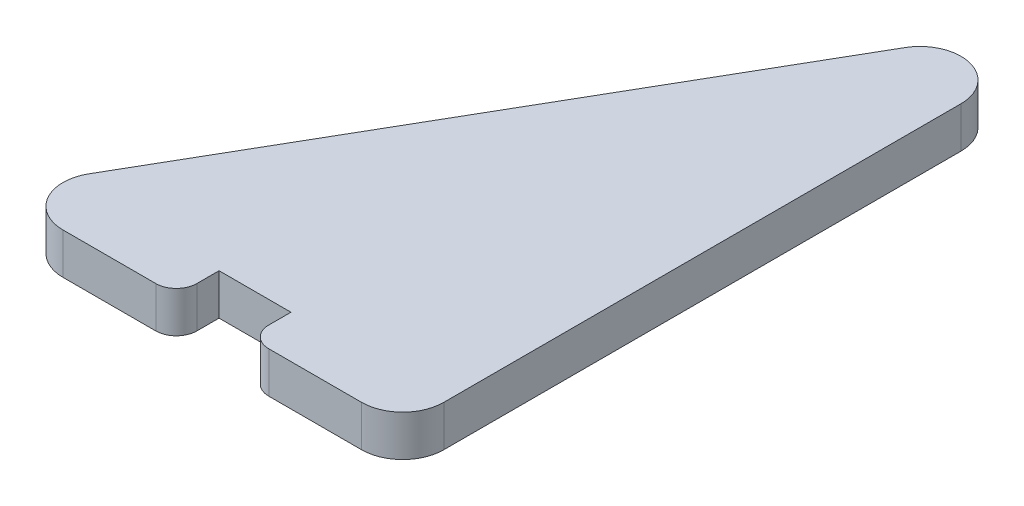
ISO-10303-21;
HEADER;
FILE_DESCRIPTION(('STEP AP214'),'2;1');
FILE_NAME('part.step','',(''),(''),'','','');
FILE_SCHEMA(('AUTOMOTIVE_DESIGN { 1 0 10303 214 1 1 1 1 }'));
ENDSEC;
DATA;
#1=APPLICATION_CONTEXT('core data for automotive mechanical design processes');
#2=APPLICATION_PROTOCOL_DEFINITION('international standard','automotive_design',2000,#1);
#3=PRODUCT_CONTEXT('',#1,'mechanical');
#4=PRODUCT('Part','Part','',(#3));
#5=PRODUCT_RELATED_PRODUCT_CATEGORY('part','',(#4));
#6=PRODUCT_DEFINITION_FORMATION('','',#4);
#7=PRODUCT_DEFINITION_CONTEXT('part definition',#1,'design');
#8=PRODUCT_DEFINITION('design','',#6,#7);
#9=PRODUCT_DEFINITION_SHAPE('','',#8);
#10=(LENGTH_UNIT() NAMED_UNIT(*) SI_UNIT(.MILLI.,.METRE.));
#11=(NAMED_UNIT(*) PLANE_ANGLE_UNIT() SI_UNIT($,.RADIAN.));
#12=(NAMED_UNIT(*) SI_UNIT($,.STERADIAN.) SOLID_ANGLE_UNIT());
#13=UNCERTAINTY_MEASURE_WITH_UNIT(LENGTH_MEASURE(1.E-05),#10,'distance_accuracy_value','');
#14=(GEOMETRIC_REPRESENTATION_CONTEXT(3) GLOBAL_UNCERTAINTY_ASSIGNED_CONTEXT((#13)) GLOBAL_UNIT_ASSIGNED_CONTEXT((#10,
#11,#12)) REPRESENTATION_CONTEXT('',''));
#15=CARTESIAN_POINT('',(0.,0.,0.));
#16=DIRECTION('',(0.,0.,1.));
#17=DIRECTION('',(1.,0.,0.));
#18=AXIS2_PLACEMENT_3D('',#15,#16,#17);
#19=CARTESIAN_POINT('',(-52.5014773719376,6.35,0.));
#20=DIRECTION('',(0.,0.,-1.));
#21=DIRECTION('',(-1.,0.,0.));
#22=AXIS2_PLACEMENT_3D('',#19,#20,#21);
#23=PLANE('',#22);
#24=DIRECTION('',(0.,-1.,0.));
#25=VECTOR('',#24,1.);
#26=CARTESIAN_POINT('',(-20.6944886859688,6.35,0.));
#27=LINE('',#26,#25);
#28=CARTESIAN_POINT('',(-20.6944886859688,6.35,0.));
#29=VERTEX_POINT('',#28);
#30=CARTESIAN_POINT('',(-20.6944886859688,0.,0.));
#31=VERTEX_POINT('',#30);
#32=EDGE_CURVE('E213',#29,#31,#27,.T.);
#33=ORIENTED_EDGE('',*,*,#32,.T.);
#34=DIRECTION('',(1.,0.,0.));
#35=VECTOR('',#34,1.);
#36=CARTESIAN_POINT('',(-52.5014773719376,0.,0.));
#37=LINE('',#36,#35);
#38=CARTESIAN_POINT('',(-6.35000000000004,0.,0.));
#39=VERTEX_POINT('',#38);
#40=EDGE_CURVE('E134',#31,#39,#37,.T.);
#41=ORIENTED_EDGE('',*,*,#40,.T.);
#42=DIRECTION('',(0.,-1.,0.));
#43=VECTOR('',#42,1.);
#44=CARTESIAN_POINT('',(-6.35000000000004,6.35,0.));
#45=LINE('',#44,#43);
#46=CARTESIAN_POINT('',(-6.35000000000004,6.35,0.));
#47=VERTEX_POINT('',#46);
#48=EDGE_CURVE('E40',#47,#39,#45,.T.);
#49=ORIENTED_EDGE('',*,*,#48,.F.);
#50=DIRECTION('',(1.,0.,0.));
#51=VECTOR('',#50,1.);
#52=CARTESIAN_POINT('',(-52.5014773719376,6.35,0.));
#53=LINE('',#52,#51);
#54=EDGE_CURVE('E166',#29,#47,#53,.T.);
#55=ORIENTED_EDGE('',*,*,#54,.F.);
#56=EDGE_LOOP('',(#33,#41,#49,#55));
#57=FACE_BOUND('',#56,.T.);
#58=ADVANCED_FACE('F32',(#57),#23,.F.);
#59=CARTESIAN_POINT('',(-52.5014773719376,6.35,-6.34999999999999));
#60=DIRECTION('',(0.,1.,0.));
#61=DIRECTION('',(0.,0.,1.));
#62=AXIS2_PLACEMENT_3D('',#59,#60,#61);
#63=PLANE('',#62);
#64=CARTESIAN_POINT('',(-38.1569886859688,6.35,-3.175));
#65=DIRECTION('',(0.,1.,0.));
#66=DIRECTION('',(0.,0.,-1.));
#67=AXIS2_PLACEMENT_3D('',#64,#65,#66);
#68=CIRCLE('',#67,3.175);
#69=CARTESIAN_POINT('',(-38.1569886859688,6.35,0.));
#70=VERTEX_POINT('',#69);
#71=CARTESIAN_POINT('',(-34.9819886859688,6.35,-3.175));
#72=VERTEX_POINT('',#71);
#73=EDGE_CURVE('E176',#70,#72,#68,.T.);
#74=ORIENTED_EDGE('',*,*,#73,.T.);
#75=DIRECTION('',(0.,0.,-1.));
#76=VECTOR('',#75,1.);
#77=CARTESIAN_POINT('',(-34.9819886859688,6.35,-6.604));
#78=LINE('',#77,#76);
#79=CARTESIAN_POINT('',(-34.9819886859688,6.35,-6.604));
#80=VERTEX_POINT('',#79);
#81=EDGE_CURVE('E226',#72,#80,#78,.T.);
#82=ORIENTED_EDGE('',*,*,#81,.T.);
#83=DIRECTION('',(1.,0.,0.));
#84=VECTOR('',#83,1.);
#85=CARTESIAN_POINT('',(-23.8694886859688,6.35,-6.604));
#86=LINE('',#85,#84);
#87=CARTESIAN_POINT('',(-23.8694886859688,6.35,-6.604));
#88=VERTEX_POINT('',#87);
#89=EDGE_CURVE('E214',#80,#88,#86,.T.);
#90=ORIENTED_EDGE('',*,*,#89,.T.);
#91=DIRECTION('',(0.,0.,1.));
#92=VECTOR('',#91,1.);
#93=CARTESIAN_POINT('',(-23.8694886859688,6.35,-3.175));
#94=LINE('',#93,#92);
#95=CARTESIAN_POINT('',(-23.8694886859688,6.35,-3.175));
#96=VERTEX_POINT('',#95);
#97=EDGE_CURVE('E210',#88,#96,#94,.T.);
#98=ORIENTED_EDGE('',*,*,#97,.T.);
#99=CARTESIAN_POINT('',(-20.6944886859688,6.35,-3.175));
#100=DIRECTION('',(0.,1.,0.));
#101=DIRECTION('',(0.,0.,-1.));
#102=AXIS2_PLACEMENT_3D('',#99,#100,#101);
#103=CIRCLE('',#102,3.175);
#104=EDGE_CURVE('E216',#96,#29,#103,.T.);
#105=ORIENTED_EDGE('',*,*,#104,.T.);
#106=ORIENTED_EDGE('',*,*,#54,.T.);
#107=CARTESIAN_POINT('',(-6.35,6.35,-6.35));
#108=DIRECTION('',(0.,1.,0.));
#109=DIRECTION('',(0.,0.,-1.));
#110=AXIS2_PLACEMENT_3D('',#107,#108,#109);
#111=CIRCLE('',#110,6.35);
#112=CARTESIAN_POINT('',(0.,6.35,-6.35000000000004));
#113=VERTEX_POINT('',#112);
#114=EDGE_CURVE('E110',#47,#113,#111,.T.);
#115=ORIENTED_EDGE('',*,*,#114,.T.);
#116=DIRECTION('',(0.,0.,-1.));
#117=VECTOR('',#116,1.);
#118=CARTESIAN_POINT('',(0.,6.35,-6.35000000000004));
#119=LINE('',#118,#117);
#120=CARTESIAN_POINT('',(0.,6.35,-86.2867036525604));
#121=VERTEX_POINT('',#120);
#122=EDGE_CURVE('E102',#113,#121,#119,.T.);
#123=ORIENTED_EDGE('',*,*,#122,.T.);
#124=CARTESIAN_POINT('',(-6.35,6.35,-86.2867036525604));
#125=DIRECTION('',(0.,1.,0.));
#126=DIRECTION('',(0.,0.,1.));
#127=AXIS2_PLACEMENT_3D('',#124,#125,#126);
#128=CIRCLE('',#127,6.35);
#129=CARTESIAN_POINT('',(-11.8492613140312,6.35,-89.4617036525604));
#130=VERTEX_POINT('',#129);
#131=EDGE_CURVE('E107',#121,#130,#128,.T.);
#132=ORIENTED_EDGE('',*,*,#131,.T.);
#133=DIRECTION('',(-0.500000000000004,0.,0.866025403784436));
#134=VECTOR('',#133,1.);
#135=CARTESIAN_POINT('',(-11.8492613140312,6.35,-89.4617036525604));
#136=LINE('',#135,#134);
#137=CARTESIAN_POINT('',(-58.0007386859687,6.35,-9.52500000000002));
#138=VERTEX_POINT('',#137);
#139=EDGE_CURVE('E56',#130,#138,#136,.T.);
#140=ORIENTED_EDGE('',*,*,#139,.T.);
#141=CARTESIAN_POINT('',(-52.5014773719376,6.35,-6.34999999999999));
#142=DIRECTION('',(0.,1.,0.));
#143=DIRECTION('',(0.,0.,1.));
#144=AXIS2_PLACEMENT_3D('',#141,#142,#143);
#145=CIRCLE('',#144,6.35);
#146=CARTESIAN_POINT('',(-52.5014773719376,6.35,0.));
#147=VERTEX_POINT('',#146);
#148=EDGE_CURVE('E145',#138,#147,#145,.T.);
#149=ORIENTED_EDGE('',*,*,#148,.T.);
#150=EDGE_CURVE('E91',#147,#70,#53,.T.);
#151=ORIENTED_EDGE('',*,*,#150,.T.);
#152=EDGE_LOOP('',(#74,#82,#90,#98,#105,#106,#115,#123,#132,#140,#149,#151));
#153=FACE_BOUND('',#152,.T.);
#154=ADVANCED_FACE('F105',(#153),#63,.T.);
#155=CARTESIAN_POINT('',(-52.5014773719376,0.,-6.34999999999999));
#156=DIRECTION('',(0.,1.,0.));
#157=DIRECTION('',(0.,0.,1.));
#158=AXIS2_PLACEMENT_3D('',#155,#156,#157);
#159=PLANE('',#158);
#160=DIRECTION('',(0.,0.,-1.));
#161=VECTOR('',#160,1.);
#162=CARTESIAN_POINT('',(-34.9819886859688,0.,-6.604));
#163=LINE('',#162,#161);
#164=CARTESIAN_POINT('',(-34.9819886859688,0.,-3.175));
#165=VERTEX_POINT('',#164);
#166=CARTESIAN_POINT('',(-34.9819886859688,0.,-6.604));
#167=VERTEX_POINT('',#166);
#168=EDGE_CURVE('E222',#165,#167,#163,.T.);
#169=ORIENTED_EDGE('',*,*,#168,.F.);
#170=CARTESIAN_POINT('',(-38.1569886859688,0.,-3.175));
#171=DIRECTION('',(0.,1.,0.));
#172=DIRECTION('',(0.,0.,-1.));
#173=AXIS2_PLACEMENT_3D('',#170,#171,#172);
#174=CIRCLE('',#173,3.175);
#175=CARTESIAN_POINT('',(-38.1569886859688,0.,0.));
#176=VERTEX_POINT('',#175);
#177=EDGE_CURVE('E232',#176,#165,#174,.T.);
#178=ORIENTED_EDGE('',*,*,#177,.F.);
#179=CARTESIAN_POINT('',(-52.5014773719376,0.,0.));
#180=VERTEX_POINT('',#179);
#181=EDGE_CURVE('E136',#180,#176,#37,.T.);
#182=ORIENTED_EDGE('',*,*,#181,.F.);
#183=CARTESIAN_POINT('',(-52.5014773719376,0.,-6.34999999999999));
#184=DIRECTION('',(0.,1.,0.));
#185=DIRECTION('',(0.,0.,1.));
#186=AXIS2_PLACEMENT_3D('',#183,#184,#185);
#187=CIRCLE('',#186,6.35);
#188=CARTESIAN_POINT('',(-58.0007386859687,0.,-9.52500000000002));
#189=VERTEX_POINT('',#188);
#190=EDGE_CURVE('E131',#189,#180,#187,.T.);
#191=ORIENTED_EDGE('',*,*,#190,.F.);
#192=DIRECTION('',(-0.500000000000004,0.,0.866025403784436));
#193=VECTOR('',#192,1.);
#194=CARTESIAN_POINT('',(-11.8492613140312,0.,-89.4617036525604));
#195=LINE('',#194,#193);
#196=CARTESIAN_POINT('',(-11.8492613140312,0.,-89.4617036525604));
#197=VERTEX_POINT('',#196);
#198=EDGE_CURVE('E83',#197,#189,#195,.T.);
#199=ORIENTED_EDGE('',*,*,#198,.F.);
#200=CARTESIAN_POINT('',(-6.35,0.,-86.2867036525604));
#201=DIRECTION('',(0.,1.,0.));
#202=DIRECTION('',(0.,0.,1.));
#203=AXIS2_PLACEMENT_3D('',#200,#201,#202);
#204=CIRCLE('',#203,6.35);
#205=CARTESIAN_POINT('',(0.,0.,-86.2867036525604));
#206=VERTEX_POINT('',#205);
#207=EDGE_CURVE('E142',#206,#197,#204,.T.);
#208=ORIENTED_EDGE('',*,*,#207,.F.);
#209=DIRECTION('',(0.,0.,-1.));
#210=VECTOR('',#209,1.);
#211=CARTESIAN_POINT('',(0.,0.,-6.35000000000004));
#212=LINE('',#211,#210);
#213=CARTESIAN_POINT('',(0.,0.,-6.35000000000004));
#214=VERTEX_POINT('',#213);
#215=EDGE_CURVE('E119',#214,#206,#212,.T.);
#216=ORIENTED_EDGE('',*,*,#215,.F.);
#217=CARTESIAN_POINT('',(-6.35,0.,-6.35));
#218=DIRECTION('',(0.,1.,0.));
#219=DIRECTION('',(0.,0.,-1.));
#220=AXIS2_PLACEMENT_3D('',#217,#218,#219);
#221=CIRCLE('',#220,6.35);
#222=EDGE_CURVE('E139',#39,#214,#221,.T.);
#223=ORIENTED_EDGE('',*,*,#222,.F.);
#224=ORIENTED_EDGE('',*,*,#40,.F.);
#225=CARTESIAN_POINT('',(-20.6944886859688,0.,-3.175));
#226=DIRECTION('',(0.,1.,0.));
#227=DIRECTION('',(0.,0.,-1.));
#228=AXIS2_PLACEMENT_3D('',#225,#226,#227);
#229=CIRCLE('',#228,3.175);
#230=CARTESIAN_POINT('',(-23.8694886859688,0.,-3.175));
#231=VERTEX_POINT('',#230);
#232=EDGE_CURVE('E230',#231,#31,#229,.T.);
#233=ORIENTED_EDGE('',*,*,#232,.F.);
#234=DIRECTION('',(0.,0.,1.));
#235=VECTOR('',#234,1.);
#236=CARTESIAN_POINT('',(-23.8694886859688,0.,-3.175));
#237=LINE('',#236,#235);
#238=CARTESIAN_POINT('',(-23.8694886859688,0.,-6.604));
#239=VERTEX_POINT('',#238);
#240=EDGE_CURVE('E47',#239,#231,#237,.T.);
#241=ORIENTED_EDGE('',*,*,#240,.F.);
#242=DIRECTION('',(1.,0.,0.));
#243=VECTOR('',#242,1.);
#244=CARTESIAN_POINT('',(-23.8694886859688,0.,-6.604));
#245=LINE('',#244,#243);
#246=EDGE_CURVE('E220',#167,#239,#245,.T.);
#247=ORIENTED_EDGE('',*,*,#246,.F.);
#248=EDGE_LOOP('',(#169,#178,#182,#191,#199,#208,#216,#223,#224,#233,#241,#247));
#249=FACE_BOUND('',#248,.T.);
#250=ADVANCED_FACE('F158',(#249),#159,.F.);
#251=CARTESIAN_POINT('',(-52.5014773719376,6.35,-6.34999999999999));
#252=DIRECTION('',(0.,-1.,0.));
#253=DIRECTION('',(0.,0.,-1.));
#254=AXIS2_PLACEMENT_3D('',#251,#252,#253);
#255=CYLINDRICAL_SURFACE('',#254,6.35);
#256=ORIENTED_EDGE('',*,*,#190,.T.);
#257=DIRECTION('',(0.,-1.,0.));
#258=VECTOR('',#257,1.);
#259=CARTESIAN_POINT('',(-52.5014773719376,6.35,0.));
#260=LINE('',#259,#258);
#261=EDGE_CURVE('E11',#147,#180,#260,.T.);
#262=ORIENTED_EDGE('',*,*,#261,.F.);
#263=ORIENTED_EDGE('',*,*,#148,.F.);
#264=DIRECTION('',(0.,-1.,0.));
#265=VECTOR('',#264,1.);
#266=CARTESIAN_POINT('',(-58.0007386859687,6.35,-9.52500000000002));
#267=LINE('',#266,#265);
#268=EDGE_CURVE('E127',#138,#189,#267,.T.);
#269=ORIENTED_EDGE('',*,*,#268,.T.);
#270=EDGE_LOOP('',(#256,#262,#263,#269));
#271=FACE_BOUND('',#270,.T.);
#272=ADVANCED_FACE('F34',(#271),#255,.T.);
#273=ORIENTED_EDGE('',*,*,#181,.T.);
#274=DIRECTION('',(0.,-1.,0.));
#275=VECTOR('',#274,1.);
#276=CARTESIAN_POINT('',(-38.1569886859688,6.35,0.));
#277=LINE('',#276,#275);
#278=EDGE_CURVE('E240',#70,#176,#277,.T.);
#279=ORIENTED_EDGE('',*,*,#278,.F.);
#280=ORIENTED_EDGE('',*,*,#150,.F.);
#281=ORIENTED_EDGE('',*,*,#261,.T.);
#282=EDGE_LOOP('',(#273,#279,#280,#281));
#283=FACE_BOUND('',#282,.T.);
#284=ADVANCED_FACE('F242',(#283),#23,.F.);
#285=CARTESIAN_POINT('',(-6.35,6.35,-6.35));
#286=DIRECTION('',(0.,-1.,0.));
#287=DIRECTION('',(0.,0.,-1.));
#288=AXIS2_PLACEMENT_3D('',#285,#286,#287);
#289=CYLINDRICAL_SURFACE('',#288,6.35);
#290=ORIENTED_EDGE('',*,*,#222,.T.);
#291=DIRECTION('',(0.,-1.,0.));
#292=VECTOR('',#291,1.);
#293=CARTESIAN_POINT('',(0.,6.35,-6.35000000000004));
#294=LINE('',#293,#292);
#295=EDGE_CURVE('E122',#113,#214,#294,.T.);
#296=ORIENTED_EDGE('',*,*,#295,.F.);
#297=ORIENTED_EDGE('',*,*,#114,.F.);
#298=ORIENTED_EDGE('',*,*,#48,.T.);
#299=EDGE_LOOP('',(#290,#296,#297,#298));
#300=FACE_BOUND('',#299,.T.);
#301=ADVANCED_FACE('F152',(#300),#289,.T.);
#302=CARTESIAN_POINT('',(0.,6.35,-6.35000000000004));
#303=DIRECTION('',(-1.,0.,0.));
#304=DIRECTION('',(0.,0.,1.));
#305=AXIS2_PLACEMENT_3D('',#302,#303,#304);
#306=PLANE('',#305);
#307=ORIENTED_EDGE('',*,*,#215,.T.);
#308=DIRECTION('',(0.,-1.,0.));
#309=VECTOR('',#308,1.);
#310=CARTESIAN_POINT('',(0.,6.35,-86.2867036525604));
#311=LINE('',#310,#309);
#312=EDGE_CURVE('E116',#121,#206,#311,.T.);
#313=ORIENTED_EDGE('',*,*,#312,.F.);
#314=ORIENTED_EDGE('',*,*,#122,.F.);
#315=ORIENTED_EDGE('',*,*,#295,.T.);
#316=EDGE_LOOP('',(#307,#313,#314,#315));
#317=FACE_BOUND('',#316,.T.);
#318=ADVANCED_FACE('F117',(#317),#306,.F.);
#319=CARTESIAN_POINT('',(-6.35,6.35,-86.2867036525604));
#320=DIRECTION('',(0.,-1.,0.));
#321=DIRECTION('',(0.,0.,-1.));
#322=AXIS2_PLACEMENT_3D('',#319,#320,#321);
#323=CYLINDRICAL_SURFACE('',#322,6.35);
#324=ORIENTED_EDGE('',*,*,#207,.T.);
#325=DIRECTION('',(0.,-1.,0.));
#326=VECTOR('',#325,1.);
#327=CARTESIAN_POINT('',(-11.8492613140312,6.35,-89.4617036525604));
#328=LINE('',#327,#326);
#329=EDGE_CURVE('E123',#130,#197,#328,.T.);
#330=ORIENTED_EDGE('',*,*,#329,.F.);
#331=ORIENTED_EDGE('',*,*,#131,.F.);
#332=ORIENTED_EDGE('',*,*,#312,.T.);
#333=EDGE_LOOP('',(#324,#330,#331,#332));
#334=FACE_BOUND('',#333,.T.);
#335=ADVANCED_FACE('F125',(#334),#323,.T.);
#336=CARTESIAN_POINT('',(-11.8492613140312,6.35,-89.4617036525604));
#337=DIRECTION('',(0.866025403784436,0.,0.500000000000004));
#338=DIRECTION('',(0.500000000000004,0.,-0.866025403784436));
#339=AXIS2_PLACEMENT_3D('',#336,#337,#338);
#340=PLANE('',#339);
#341=ORIENTED_EDGE('',*,*,#198,.T.);
#342=ORIENTED_EDGE('',*,*,#268,.F.);
#343=ORIENTED_EDGE('',*,*,#139,.F.);
#344=ORIENTED_EDGE('',*,*,#329,.T.);
#345=EDGE_LOOP('',(#341,#342,#343,#344));
#346=FACE_BOUND('',#345,.T.);
#347=ADVANCED_FACE('F162',(#346),#340,.F.);
#348=CARTESIAN_POINT('',(-23.8694886859688,6.35,-3.175));
#349=DIRECTION('',(1.,0.,0.));
#350=DIRECTION('',(0.,0.,-1.));
#351=AXIS2_PLACEMENT_3D('',#348,#349,#350);
#352=PLANE('',#351);
#353=ORIENTED_EDGE('',*,*,#240,.T.);
#354=DIRECTION('',(0.,-1.,0.));
#355=VECTOR('',#354,1.);
#356=CARTESIAN_POINT('',(-23.8694886859688,6.35,-3.175));
#357=LINE('',#356,#355);
#358=EDGE_CURVE('E170',#96,#231,#357,.T.);
#359=ORIENTED_EDGE('',*,*,#358,.F.);
#360=ORIENTED_EDGE('',*,*,#97,.F.);
#361=DIRECTION('',(0.,-1.,0.));
#362=VECTOR('',#361,1.);
#363=CARTESIAN_POINT('',(-23.8694886859688,6.35,-6.604));
#364=LINE('',#363,#362);
#365=EDGE_CURVE('E135',#88,#239,#364,.T.);
#366=ORIENTED_EDGE('',*,*,#365,.T.);
#367=EDGE_LOOP('',(#353,#359,#360,#366));
#368=FACE_BOUND('',#367,.T.);
#369=ADVANCED_FACE('F208',(#368),#352,.F.);
#370=CARTESIAN_POINT('',(-23.8694886859688,6.35,-6.604));
#371=DIRECTION('',(0.,0.,-1.));
#372=DIRECTION('',(-1.,0.,0.));
#373=AXIS2_PLACEMENT_3D('',#370,#371,#372);
#374=PLANE('',#373);
#375=ORIENTED_EDGE('',*,*,#246,.T.);
#376=ORIENTED_EDGE('',*,*,#365,.F.);
#377=ORIENTED_EDGE('',*,*,#89,.F.);
#378=DIRECTION('',(0.,-1.,0.));
#379=VECTOR('',#378,1.);
#380=CARTESIAN_POINT('',(-34.9819886859688,6.35,-6.604));
#381=LINE('',#380,#379);
#382=EDGE_CURVE('E204',#80,#167,#381,.T.);
#383=ORIENTED_EDGE('',*,*,#382,.T.);
#384=EDGE_LOOP('',(#375,#376,#377,#383));
#385=FACE_BOUND('',#384,.T.);
#386=ADVANCED_FACE('F259',(#385),#374,.F.);
#387=CARTESIAN_POINT('',(-34.9819886859688,6.35,-6.604));
#388=DIRECTION('',(-1.,0.,0.));
#389=DIRECTION('',(0.,0.,1.));
#390=AXIS2_PLACEMENT_3D('',#387,#388,#389);
#391=PLANE('',#390);
#392=ORIENTED_EDGE('',*,*,#168,.T.);
#393=ORIENTED_EDGE('',*,*,#382,.F.);
#394=ORIENTED_EDGE('',*,*,#81,.F.);
#395=DIRECTION('',(0.,-1.,0.));
#396=VECTOR('',#395,1.);
#397=CARTESIAN_POINT('',(-34.9819886859688,6.35,-3.175));
#398=LINE('',#397,#396);
#399=EDGE_CURVE('E238',#72,#165,#398,.T.);
#400=ORIENTED_EDGE('',*,*,#399,.T.);
#401=EDGE_LOOP('',(#392,#393,#394,#400));
#402=FACE_BOUND('',#401,.T.);
#403=ADVANCED_FACE('F258',(#402),#391,.F.);
#404=CARTESIAN_POINT('',(-38.1569886859688,6.35,-3.175));
#405=DIRECTION('',(0.,-1.,0.));
#406=DIRECTION('',(0.,0.,-1.));
#407=AXIS2_PLACEMENT_3D('',#404,#405,#406);
#408=CYLINDRICAL_SURFACE('',#407,3.175);
#409=ORIENTED_EDGE('',*,*,#177,.T.);
#410=ORIENTED_EDGE('',*,*,#399,.F.);
#411=ORIENTED_EDGE('',*,*,#73,.F.);
#412=ORIENTED_EDGE('',*,*,#278,.T.);
#413=EDGE_LOOP('',(#409,#410,#411,#412));
#414=FACE_BOUND('',#413,.T.);
#415=ADVANCED_FACE('F255',(#414),#408,.T.);
#416=CARTESIAN_POINT('',(-20.6944886859688,6.35,-3.175));
#417=DIRECTION('',(0.,-1.,0.));
#418=DIRECTION('',(0.,0.,-1.));
#419=AXIS2_PLACEMENT_3D('',#416,#417,#418);
#420=CYLINDRICAL_SURFACE('',#419,3.175);
#421=ORIENTED_EDGE('',*,*,#232,.T.);
#422=ORIENTED_EDGE('',*,*,#32,.F.);
#423=ORIENTED_EDGE('',*,*,#104,.F.);
#424=ORIENTED_EDGE('',*,*,#358,.T.);
#425=EDGE_LOOP('',(#421,#422,#423,#424));
#426=FACE_BOUND('',#425,.T.);
#427=ADVANCED_FACE('F217',(#426),#420,.T.);
#428=CLOSED_SHELL('',(#58,#154,#250,#272,#284,#301,#318,#335,#347,#369,#386,#403,#415,#427));
#429=MANIFOLD_SOLID_BREP('B2',#428);
#430=ADVANCED_BREP_SHAPE_REPRESENTATION('',(#18,#429),#14);
#431=SHAPE_DEFINITION_REPRESENTATION(#9,#430);
ENDSEC;
END-ISO-10303-21;
